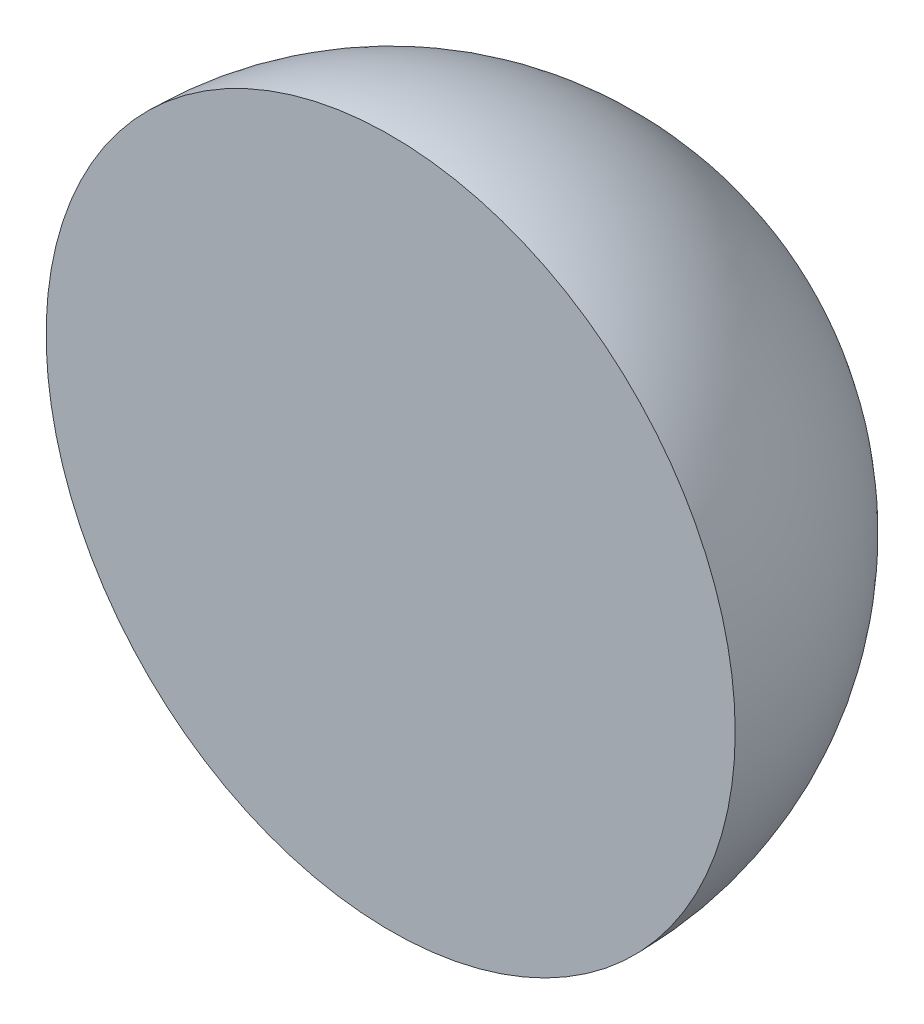
ISO-10303-21;
HEADER;
FILE_DESCRIPTION(('STEP AP214'),'2;1');
FILE_NAME('part.step','',(''),(''),'','','');
FILE_SCHEMA(('AUTOMOTIVE_DESIGN { 1 0 10303 214 1 1 1 1 }'));
ENDSEC;
DATA;
#1=APPLICATION_CONTEXT('core data for automotive mechanical design processes');
#2=APPLICATION_PROTOCOL_DEFINITION('international standard','automotive_design',2000,#1);
#3=PRODUCT_CONTEXT('',#1,'mechanical');
#4=PRODUCT('Part','Part','',(#3));
#5=PRODUCT_RELATED_PRODUCT_CATEGORY('part','',(#4));
#6=PRODUCT_DEFINITION_FORMATION('','',#4);
#7=PRODUCT_DEFINITION_CONTEXT('part definition',#1,'design');
#8=PRODUCT_DEFINITION('design','',#6,#7);
#9=PRODUCT_DEFINITION_SHAPE('','',#8);
#10=(LENGTH_UNIT() NAMED_UNIT(*) SI_UNIT(.MILLI.,.METRE.));
#11=(NAMED_UNIT(*) PLANE_ANGLE_UNIT() SI_UNIT($,.RADIAN.));
#12=(NAMED_UNIT(*) SI_UNIT($,.STERADIAN.) SOLID_ANGLE_UNIT());
#13=UNCERTAINTY_MEASURE_WITH_UNIT(LENGTH_MEASURE(1.E-05),#10,'distance_accuracy_value','');
#14=(GEOMETRIC_REPRESENTATION_CONTEXT(3) GLOBAL_UNCERTAINTY_ASSIGNED_CONTEXT((#13)) GLOBAL_UNIT_ASSIGNED_CONTEXT((#10,
#11,#12)) REPRESENTATION_CONTEXT('',''));
#15=CARTESIAN_POINT('',(0.,0.,0.));
#16=DIRECTION('',(0.,0.,1.));
#17=DIRECTION('',(1.,0.,0.));
#18=AXIS2_PLACEMENT_3D('',#15,#16,#17);
#19=CARTESIAN_POINT('',(0.,0.,0.));
#20=DIRECTION('',(0.,-1.,0.));
#21=DIRECTION('',(1.,0.,0.));
#22=AXIS2_PLACEMENT_3D('',#19,#20,#21);
#23=SPHERICAL_SURFACE('',#22,5.);
#24=CARTESIAN_POINT('',(0.,0.,0.));
#25=DIRECTION('',(0.,0.,-1.));
#26=DIRECTION('',(1.,0.,0.));
#27=AXIS2_PLACEMENT_3D('',#24,#25,#26);
#28=SPHERICAL_SURFACE('',#27,5.);
#29=CARTESIAN_POINT('',(0.,0.,0.));
#30=DIRECTION('',(0.,0.,-1.));
#31=DIRECTION('',(1.,0.,0.));
#32=AXIS2_PLACEMENT_3D('',#29,#30,#31);
#33=CIRCLE('',#32,5.);
#34=CARTESIAN_POINT('',(5.,0.,0.));
#35=VERTEX_POINT('',#34);
#36=EDGE_CURVE('E10',#35,#35,#33,.T.);
#37=ORIENTED_EDGE('',*,*,#36,.T.);
#38=EDGE_LOOP('',(#37));
#39=FACE_BOUND('',#38,.T.);
#40=ADVANCED_FACE('F40',(#39),#28,.T.);
#41=CARTESIAN_POINT('',(0.,0.,0.));
#42=DIRECTION('',(0.,0.,1.));
#43=DIRECTION('',(1.,0.,0.));
#44=AXIS2_PLACEMENT_3D('',#41,#42,#43);
#45=PLANE('',#44);
#46=ORIENTED_EDGE('',*,*,#36,.F.);
#47=EDGE_LOOP('',(#46));
#48=FACE_BOUND('',#47,.T.);
#49=ADVANCED_FACE('F44',(#48),#45,.T.);
#50=CLOSED_SHELL('',(#40,#49));
#51=MANIFOLD_SOLID_BREP('B2',#50);
#52=ADVANCED_BREP_SHAPE_REPRESENTATION('',(#18,#51),#14);
#53=SHAPE_DEFINITION_REPRESENTATION(#9,#52);
ENDSEC;
END-ISO-10303-21;
